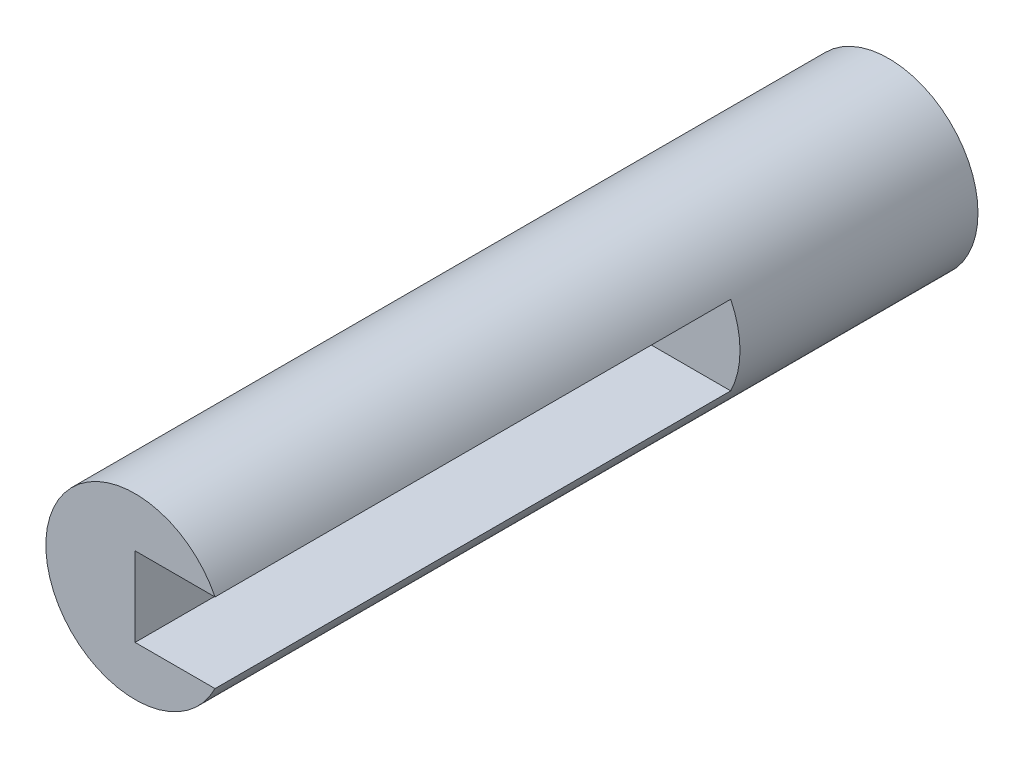
ISO-10303-21;
HEADER;
FILE_DESCRIPTION(('STEP AP214'),'2;1');
FILE_NAME('part.step','',(''),(''),'','','');
FILE_SCHEMA(('AUTOMOTIVE_DESIGN { 1 0 10303 214 1 1 1 1 }'));
ENDSEC;
DATA;
#1=APPLICATION_CONTEXT('core data for automotive mechanical design processes');
#2=APPLICATION_PROTOCOL_DEFINITION('international standard','automotive_design',2000,#1);
#3=PRODUCT_CONTEXT('',#1,'mechanical');
#4=PRODUCT('Part','Part','',(#3));
#5=PRODUCT_RELATED_PRODUCT_CATEGORY('part','',(#4));
#6=PRODUCT_DEFINITION_FORMATION('','',#4);
#7=PRODUCT_DEFINITION_CONTEXT('part definition',#1,'design');
#8=PRODUCT_DEFINITION('design','',#6,#7);
#9=PRODUCT_DEFINITION_SHAPE('','',#8);
#10=(LENGTH_UNIT() NAMED_UNIT(*) SI_UNIT(.MILLI.,.METRE.));
#11=(NAMED_UNIT(*) PLANE_ANGLE_UNIT() SI_UNIT($,.RADIAN.));
#12=(NAMED_UNIT(*) SI_UNIT($,.STERADIAN.) SOLID_ANGLE_UNIT());
#13=UNCERTAINTY_MEASURE_WITH_UNIT(LENGTH_MEASURE(1.E-05),#10,'distance_accuracy_value','');
#14=(GEOMETRIC_REPRESENTATION_CONTEXT(3) GLOBAL_UNCERTAINTY_ASSIGNED_CONTEXT((#13)) GLOBAL_UNIT_ASSIGNED_CONTEXT((#10,
#11,#12)) REPRESENTATION_CONTEXT('',''));
#15=CARTESIAN_POINT('',(0.,0.,0.));
#16=DIRECTION('',(0.,0.,1.));
#17=DIRECTION('',(1.,0.,0.));
#18=AXIS2_PLACEMENT_3D('',#15,#16,#17);
#19=CARTESIAN_POINT('',(-11.3048860547453,8.13400338085335,0.));
#20=DIRECTION('',(0.,0.,1.));
#21=DIRECTION('',(1.,0.,0.));
#22=AXIS2_PLACEMENT_3D('',#19,#20,#21);
#23=PLANE('',#22);
#24=CARTESIAN_POINT('',(-11.3048860547453,8.13400338085335,0.));
#25=DIRECTION('',(0.,0.,1.));
#26=DIRECTION('',(1.,0.,0.));
#27=AXIS2_PLACEMENT_3D('',#24,#25,#26);
#28=CIRCLE('',#27,2.5);
#29=CARTESIAN_POINT('',(-8.80488605474533,8.13400338085335,0.));
#30=VERTEX_POINT('',#29);
#31=EDGE_CURVE('E175',#30,#30,#28,.T.);
#32=ORIENTED_EDGE('',*,*,#31,.T.);
#33=EDGE_LOOP('',(#32));
#34=FACE_BOUND('',#33,.T.);
#35=CARTESIAN_POINT('',(-11.3048860547453,8.13400338085335,0.));
#36=DIRECTION('',(0.,0.,1.));
#37=DIRECTION('',(1.,0.,0.));
#38=AXIS2_PLACEMENT_3D('',#35,#36,#37);
#39=CIRCLE('',#38,4.5);
#40=CARTESIAN_POINT('',(-6.80488605474533,8.13400338085335,0.));
#41=VERTEX_POINT('',#40);
#42=EDGE_CURVE('E178',#41,#41,#39,.T.);
#43=ORIENTED_EDGE('',*,*,#42,.F.);
#44=EDGE_LOOP('',(#43));
#45=FACE_BOUND('',#44,.T.);
#46=ADVANCED_FACE('F39',(#34,#45),#23,.F.);
#47=CARTESIAN_POINT('',(-11.3048860547453,8.13400338085335,38.));
#48=DIRECTION('',(0.,0.,-1.));
#49=DIRECTION('',(-1.,0.,0.));
#50=AXIS2_PLACEMENT_3D('',#47,#48,#49);
#51=CYLINDRICAL_SURFACE('',#50,4.5);
#52=CARTESIAN_POINT('',(-11.3048860547453,8.13400338085335,38.));
#53=DIRECTION('',(0.,0.,1.));
#54=DIRECTION('',(1.,0.,0.));
#55=AXIS2_PLACEMENT_3D('',#52,#53,#54);
#56=CIRCLE('',#55,4.5);
#57=CARTESIAN_POINT('',(-7.27375718059606,10.1340033808534,38.));
#58=VERTEX_POINT('',#57);
#59=CARTESIAN_POINT('',(-7.27375718059606,6.13400338085335,38.));
#60=VERTEX_POINT('',#59);
#61=EDGE_CURVE('E188',#58,#60,#56,.T.);
#62=ORIENTED_EDGE('',*,*,#61,.F.);
#63=DIRECTION('',(0.,0.,-1.));
#64=VECTOR('',#63,1.);
#65=CARTESIAN_POINT('',(-7.27375718059606,10.1340033808533,38.));
#66=LINE('',#65,#64);
#67=CARTESIAN_POINT('',(-7.27375718059606,10.1340033808534,12.));
#68=VERTEX_POINT('',#67);
#69=EDGE_CURVE('E141',#58,#68,#66,.T.);
#70=ORIENTED_EDGE('',*,*,#69,.T.);
#71=CARTESIAN_POINT('',(-11.3048860547453,8.13400338085335,12.));
#72=DIRECTION('',(0.,0.,1.));
#73=DIRECTION('',(1.,0.,0.));
#74=AXIS2_PLACEMENT_3D('',#71,#72,#73);
#75=CIRCLE('',#74,4.5);
#76=CARTESIAN_POINT('',(-7.27375718059606,6.13400338085335,12.));
#77=VERTEX_POINT('',#76);
#78=EDGE_CURVE('E11',#77,#68,#75,.T.);
#79=ORIENTED_EDGE('',*,*,#78,.F.);
#80=DIRECTION('',(0.,0.,-1.));
#81=VECTOR('',#80,1.);
#82=CARTESIAN_POINT('',(-7.27375718059606,6.13400338085335,38.));
#83=LINE('',#82,#81);
#84=EDGE_CURVE('E119',#77,#60,#83,.F.);
#85=ORIENTED_EDGE('',*,*,#84,.T.);
#86=EDGE_LOOP('',(#62,#70,#79,#85));
#87=FACE_BOUND('',#86,.T.);
#88=ORIENTED_EDGE('',*,*,#42,.T.);
#89=EDGE_LOOP('',(#88));
#90=FACE_BOUND('',#89,.T.);
#91=ADVANCED_FACE('F41',(#87,#90),#51,.T.);
#92=CARTESIAN_POINT('',(-11.3048860547453,8.13400338085335,38.));
#93=DIRECTION('',(0.,0.,1.));
#94=DIRECTION('',(1.,0.,0.));
#95=AXIS2_PLACEMENT_3D('',#92,#93,#94);
#96=PLANE('',#95);
#97=DIRECTION('',(-1.,0.,0.));
#98=VECTOR('',#97,1.);
#99=CARTESIAN_POINT('',(-11.3048860547453,10.1340033808534,38.));
#100=LINE('',#99,#98);
#101=CARTESIAN_POINT('',(-11.3048860547453,10.1340033808534,38.));
#102=VERTEX_POINT('',#101);
#103=EDGE_CURVE('E48',#58,#102,#100,.T.);
#104=ORIENTED_EDGE('',*,*,#103,.F.);
#105=ORIENTED_EDGE('',*,*,#61,.T.);
#106=DIRECTION('',(1.,0.,0.));
#107=VECTOR('',#106,1.);
#108=CARTESIAN_POINT('',(-11.3048860547453,6.13400338085335,38.));
#109=LINE('',#108,#107);
#110=CARTESIAN_POINT('',(-11.3048860547453,6.13400338085335,38.));
#111=VERTEX_POINT('',#110);
#112=EDGE_CURVE('E128',#111,#60,#109,.T.);
#113=ORIENTED_EDGE('',*,*,#112,.F.);
#114=DIRECTION('',(0.,-1.,0.));
#115=VECTOR('',#114,1.);
#116=CARTESIAN_POINT('',(-11.3048860547453,10.1340033808534,38.));
#117=LINE('',#116,#115);
#118=EDGE_CURVE('E55',#102,#111,#117,.T.);
#119=ORIENTED_EDGE('',*,*,#118,.F.);
#120=EDGE_LOOP('',(#104,#105,#113,#119));
#121=FACE_BOUND('',#120,.T.);
#122=ADVANCED_FACE('F200',(#121),#96,.T.);
#123=CARTESIAN_POINT('',(0.,0.,1.5));
#124=DIRECTION('',(0.,0.,1.));
#125=DIRECTION('',(1.,0.,0.));
#126=AXIS2_PLACEMENT_3D('',#123,#124,#125);
#127=PLANE('',#126);
#128=DIRECTION('',(-1.,0.,0.));
#129=VECTOR('',#128,1.);
#130=CARTESIAN_POINT('',(0.,6.63400338085335,1.5));
#131=LINE('',#130,#129);
#132=CARTESIAN_POINT('',(-9.30488605474533,6.63400338085335,1.5));
#133=VERTEX_POINT('',#132);
#134=CARTESIAN_POINT('',(-13.3048860547453,6.63400338085335,1.5));
#135=VERTEX_POINT('',#134);
#136=EDGE_CURVE('E169',#133,#135,#131,.T.);
#137=ORIENTED_EDGE('',*,*,#136,.F.);
#138=CARTESIAN_POINT('',(-11.3048860547453,8.13400338085335,1.5));
#139=DIRECTION('',(0.,0.,1.));
#140=DIRECTION('',(1.,0.,0.));
#141=AXIS2_PLACEMENT_3D('',#138,#139,#140);
#142=CIRCLE('',#141,2.5);
#143=EDGE_CURVE('E182',#135,#133,#142,.T.);
#144=ORIENTED_EDGE('',*,*,#143,.F.);
#145=EDGE_LOOP('',(#137,#144));
#146=FACE_BOUND('',#145,.T.);
#147=ADVANCED_FACE('F213',(#146),#127,.F.);
#148=CARTESIAN_POINT('',(-11.3048860547453,8.13400338085335,1.5));
#149=DIRECTION('',(0.,0.,-1.));
#150=DIRECTION('',(-1.,0.,0.));
#151=AXIS2_PLACEMENT_3D('',#148,#149,#150);
#152=CYLINDRICAL_SURFACE('',#151,2.5);
#153=ORIENTED_EDGE('',*,*,#31,.F.);
#154=EDGE_LOOP('',(#153));
#155=FACE_BOUND('',#154,.T.);
#156=DIRECTION('',(0.,0.,-1.));
#157=VECTOR('',#156,1.);
#158=CARTESIAN_POINT('',(-13.3048860547453,6.63400338085335,7.5));
#159=LINE('',#158,#157);
#160=CARTESIAN_POINT('',(-13.3048860547453,6.63400338085335,7.5));
#161=VERTEX_POINT('',#160);
#162=EDGE_CURVE('E163',#161,#135,#159,.T.);
#163=ORIENTED_EDGE('',*,*,#162,.T.);
#164=ORIENTED_EDGE('',*,*,#143,.T.);
#165=DIRECTION('',(0.,0.,-1.));
#166=VECTOR('',#165,1.);
#167=CARTESIAN_POINT('',(-9.30488605474533,6.63400338085335,7.5));
#168=LINE('',#167,#166);
#169=CARTESIAN_POINT('',(-9.30488605474533,6.63400338085335,7.5));
#170=VERTEX_POINT('',#169);
#171=EDGE_CURVE('E160',#170,#133,#168,.T.);
#172=ORIENTED_EDGE('',*,*,#171,.F.);
#173=CARTESIAN_POINT('',(-11.3048860547453,8.13400338085335,7.5));
#174=DIRECTION('',(0.,0.,1.));
#175=DIRECTION('',(1.,0.,0.));
#176=AXIS2_PLACEMENT_3D('',#173,#174,#175);
#177=CIRCLE('',#176,2.5);
#178=CARTESIAN_POINT('',(-9.30488605474533,9.63400338085335,7.5));
#179=VERTEX_POINT('',#178);
#180=EDGE_CURVE('E152',#170,#179,#177,.T.);
#181=ORIENTED_EDGE('',*,*,#180,.T.);
#182=DIRECTION('',(0.,0.,-1.));
#183=VECTOR('',#182,1.);
#184=CARTESIAN_POINT('',(-9.30488605474533,9.63400338085335,7.5));
#185=LINE('',#184,#183);
#186=CARTESIAN_POINT('',(-9.30488605474533,9.63400338085335,1.5));
#187=VERTEX_POINT('',#186);
#188=EDGE_CURVE('E156',#179,#187,#185,.T.);
#189=ORIENTED_EDGE('',*,*,#188,.T.);
#190=CARTESIAN_POINT('',(-11.3048860547453,8.13400338085335,1.5));
#191=DIRECTION('',(0.,0.,1.));
#192=DIRECTION('',(1.,0.,0.));
#193=AXIS2_PLACEMENT_3D('',#190,#191,#192);
#194=CIRCLE('',#193,2.5);
#195=CARTESIAN_POINT('',(-13.3048860547453,9.63400338085335,1.5));
#196=VERTEX_POINT('',#195);
#197=EDGE_CURVE('E174',#187,#196,#194,.T.);
#198=ORIENTED_EDGE('',*,*,#197,.T.);
#199=DIRECTION('',(0.,0.,-1.));
#200=VECTOR('',#199,1.);
#201=CARTESIAN_POINT('',(-13.3048860547453,9.63400338085335,7.5));
#202=LINE('',#201,#200);
#203=CARTESIAN_POINT('',(-13.3048860547453,9.63400338085335,7.5));
#204=VERTEX_POINT('',#203);
#205=EDGE_CURVE('E63',#204,#196,#202,.T.);
#206=ORIENTED_EDGE('',*,*,#205,.F.);
#207=EDGE_CURVE('E148',#204,#161,#177,.T.);
#208=ORIENTED_EDGE('',*,*,#207,.T.);
#209=EDGE_LOOP('',(#163,#164,#172,#181,#189,#198,#206,#208));
#210=FACE_BOUND('',#209,.T.);
#211=ADVANCED_FACE('F216',(#155,#210),#152,.F.);
#212=CARTESIAN_POINT('',(0.,0.,1.5));
#213=DIRECTION('',(0.,0.,1.));
#214=DIRECTION('',(1.,0.,0.));
#215=AXIS2_PLACEMENT_3D('',#212,#213,#214);
#216=PLANE('',#215);
#217=DIRECTION('',(-1.,0.,0.));
#218=VECTOR('',#217,1.);
#219=CARTESIAN_POINT('',(0.,9.63400338085335,1.5));
#220=LINE('',#219,#218);
#221=EDGE_CURVE('E170',#187,#196,#220,.T.);
#222=ORIENTED_EDGE('',*,*,#221,.T.);
#223=ORIENTED_EDGE('',*,*,#197,.F.);
#224=EDGE_LOOP('',(#222,#223));
#225=FACE_BOUND('',#224,.T.);
#226=ADVANCED_FACE('F220',(#225),#216,.F.);
#227=CARTESIAN_POINT('',(0.,6.63400338085335,7.5));
#228=DIRECTION('',(0.,-1.,0.));
#229=DIRECTION('',(0.,0.,-1.));
#230=AXIS2_PLACEMENT_3D('',#227,#228,#229);
#231=PLANE('',#230);
#232=ORIENTED_EDGE('',*,*,#162,.F.);
#233=DIRECTION('',(-1.,0.,0.));
#234=VECTOR('',#233,1.);
#235=CARTESIAN_POINT('',(0.,6.63400338085335,7.5));
#236=LINE('',#235,#234);
#237=EDGE_CURVE('E151',#170,#161,#236,.T.);
#238=ORIENTED_EDGE('',*,*,#237,.F.);
#239=ORIENTED_EDGE('',*,*,#171,.T.);
#240=ORIENTED_EDGE('',*,*,#136,.T.);
#241=EDGE_LOOP('',(#232,#238,#239,#240));
#242=FACE_BOUND('',#241,.T.);
#243=ADVANCED_FACE('F224',(#242),#231,.F.);
#244=CARTESIAN_POINT('',(0.,9.63400338085335,7.5));
#245=DIRECTION('',(0.,-1.,0.));
#246=DIRECTION('',(0.,0.,-1.));
#247=AXIS2_PLACEMENT_3D('',#244,#245,#246);
#248=PLANE('',#247);
#249=ORIENTED_EDGE('',*,*,#221,.F.);
#250=ORIENTED_EDGE('',*,*,#188,.F.);
#251=DIRECTION('',(-1.,0.,0.));
#252=VECTOR('',#251,1.);
#253=CARTESIAN_POINT('',(0.,9.63400338085335,7.5));
#254=LINE('',#253,#252);
#255=EDGE_CURVE('E145',#179,#204,#254,.T.);
#256=ORIENTED_EDGE('',*,*,#255,.T.);
#257=ORIENTED_EDGE('',*,*,#205,.T.);
#258=EDGE_LOOP('',(#249,#250,#256,#257));
#259=FACE_BOUND('',#258,.T.);
#260=ADVANCED_FACE('F226',(#259),#248,.T.);
#261=CARTESIAN_POINT('',(0.,0.,7.5));
#262=DIRECTION('',(0.,0.,1.));
#263=DIRECTION('',(1.,0.,0.));
#264=AXIS2_PLACEMENT_3D('',#261,#262,#263);
#265=PLANE('',#264);
#266=ORIENTED_EDGE('',*,*,#255,.F.);
#267=ORIENTED_EDGE('',*,*,#180,.F.);
#268=ORIENTED_EDGE('',*,*,#237,.T.);
#269=ORIENTED_EDGE('',*,*,#207,.F.);
#270=EDGE_LOOP('',(#266,#267,#268,#269));
#271=FACE_BOUND('',#270,.T.);
#272=ADVANCED_FACE('F229',(#271),#265,.F.);
#273=CARTESIAN_POINT('',(0.,0.,12.));
#274=DIRECTION('',(0.,0.,1.));
#275=DIRECTION('',(1.,0.,0.));
#276=AXIS2_PLACEMENT_3D('',#273,#274,#275);
#277=PLANE('',#276);
#278=ORIENTED_EDGE('',*,*,#78,.T.);
#279=DIRECTION('',(-1.,0.,0.));
#280=VECTOR('',#279,1.);
#281=CARTESIAN_POINT('',(-11.3048860547453,10.1340033808534,12.));
#282=LINE('',#281,#280);
#283=CARTESIAN_POINT('',(-11.3048860547453,10.1340033808534,12.));
#284=VERTEX_POINT('',#283);
#285=EDGE_CURVE('E113',#68,#284,#282,.T.);
#286=ORIENTED_EDGE('',*,*,#285,.T.);
#287=DIRECTION('',(0.,-1.,0.));
#288=VECTOR('',#287,1.);
#289=CARTESIAN_POINT('',(-11.3048860547453,10.1340033808534,12.));
#290=LINE('',#289,#288);
#291=CARTESIAN_POINT('',(-11.3048860547453,6.13400338085335,12.));
#292=VERTEX_POINT('',#291);
#293=EDGE_CURVE('E108',#284,#292,#290,.T.);
#294=ORIENTED_EDGE('',*,*,#293,.T.);
#295=DIRECTION('',(1.,0.,0.));
#296=VECTOR('',#295,1.);
#297=CARTESIAN_POINT('',(-11.3048860547453,6.13400338085335,12.));
#298=LINE('',#297,#296);
#299=EDGE_CURVE('E116',#292,#77,#298,.T.);
#300=ORIENTED_EDGE('',*,*,#299,.T.);
#301=EDGE_LOOP('',(#278,#286,#294,#300));
#302=FACE_BOUND('',#301,.T.);
#303=ADVANCED_FACE('F124',(#302),#277,.T.);
#304=CARTESIAN_POINT('',(-11.3048860547453,10.1340033808534,12.));
#305=DIRECTION('',(0.,1.,0.));
#306=DIRECTION('',(0.,0.,1.));
#307=AXIS2_PLACEMENT_3D('',#304,#305,#306);
#308=PLANE('',#307);
#309=ORIENTED_EDGE('',*,*,#103,.T.);
#310=DIRECTION('',(0.,0.,1.));
#311=VECTOR('',#310,1.);
#312=CARTESIAN_POINT('',(-11.3048860547453,10.1340033808534,12.));
#313=LINE('',#312,#311);
#314=EDGE_CURVE('E112',#284,#102,#313,.T.);
#315=ORIENTED_EDGE('',*,*,#314,.F.);
#316=ORIENTED_EDGE('',*,*,#285,.F.);
#317=ORIENTED_EDGE('',*,*,#69,.F.);
#318=EDGE_LOOP('',(#309,#315,#316,#317));
#319=FACE_BOUND('',#318,.T.);
#320=ADVANCED_FACE('F197',(#319),#308,.F.);
#321=CARTESIAN_POINT('',(-11.3048860547453,6.13400338085335,12.));
#322=DIRECTION('',(0.,-1.,0.));
#323=DIRECTION('',(0.,0.,-1.));
#324=AXIS2_PLACEMENT_3D('',#321,#322,#323);
#325=PLANE('',#324);
#326=ORIENTED_EDGE('',*,*,#299,.F.);
#327=DIRECTION('',(0.,0.,1.));
#328=VECTOR('',#327,1.);
#329=CARTESIAN_POINT('',(-11.3048860547453,6.13400338085335,12.));
#330=LINE('',#329,#328);
#331=EDGE_CURVE('E104',#292,#111,#330,.T.);
#332=ORIENTED_EDGE('',*,*,#331,.T.);
#333=ORIENTED_EDGE('',*,*,#112,.T.);
#334=ORIENTED_EDGE('',*,*,#84,.F.);
#335=EDGE_LOOP('',(#326,#332,#333,#334));
#336=FACE_BOUND('',#335,.T.);
#337=ADVANCED_FACE('F117',(#336),#325,.F.);
#338=CARTESIAN_POINT('',(-11.3048860547453,10.1340033808534,12.));
#339=DIRECTION('',(-1.,0.,0.));
#340=DIRECTION('',(0.,0.,1.));
#341=AXIS2_PLACEMENT_3D('',#338,#339,#340);
#342=PLANE('',#341);
#343=ORIENTED_EDGE('',*,*,#118,.T.);
#344=ORIENTED_EDGE('',*,*,#331,.F.);
#345=ORIENTED_EDGE('',*,*,#293,.F.);
#346=ORIENTED_EDGE('',*,*,#314,.T.);
#347=EDGE_LOOP('',(#343,#344,#345,#346));
#348=FACE_BOUND('',#347,.T.);
#349=ADVANCED_FACE('F106',(#348),#342,.F.);
#350=CLOSED_SHELL('',(#46,#91,#122,#147,#211,#226,#243,#260,#272,#303,#320,#337,#349));
#351=MANIFOLD_SOLID_BREP('B2',#350);
#352=ADVANCED_BREP_SHAPE_REPRESENTATION('',(#18,#351),#14);
#353=SHAPE_DEFINITION_REPRESENTATION(#9,#352);
ENDSEC;
END-ISO-10303-21;
